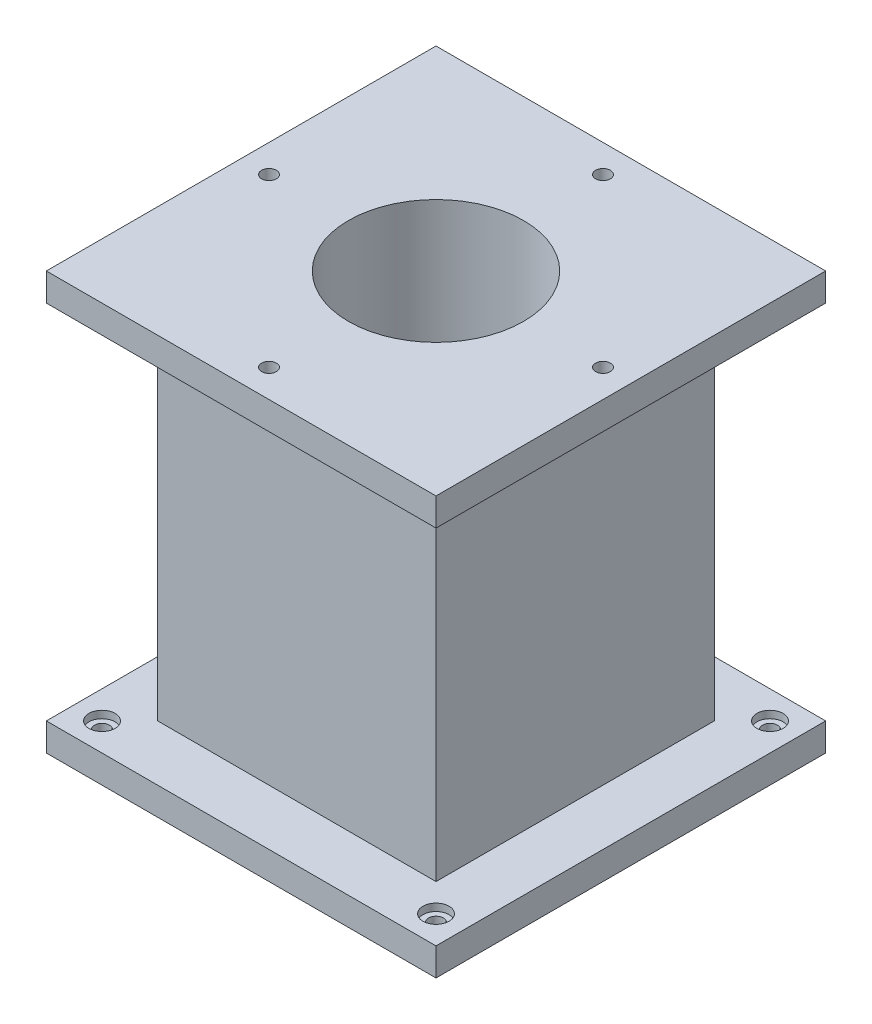
ISO-10303-21;
HEADER;
FILE_DESCRIPTION(('STEP AP214'),'2;1');
FILE_NAME('part.step','',(''),(''),'','','');
FILE_SCHEMA(('AUTOMOTIVE_DESIGN { 1 0 10303 214 1 1 1 1 }'));
ENDSEC;
DATA;
#1=APPLICATION_CONTEXT('core data for automotive mechanical design processes');
#2=APPLICATION_PROTOCOL_DEFINITION('international standard','automotive_design',2000,#1);
#3=PRODUCT_CONTEXT('',#1,'mechanical');
#4=PRODUCT('Part','Part','',(#3));
#5=PRODUCT_RELATED_PRODUCT_CATEGORY('part','',(#4));
#6=PRODUCT_DEFINITION_FORMATION('','',#4);
#7=PRODUCT_DEFINITION_CONTEXT('part definition',#1,'design');
#8=PRODUCT_DEFINITION('design','',#6,#7);
#9=PRODUCT_DEFINITION_SHAPE('','',#8);
#10=(LENGTH_UNIT() NAMED_UNIT(*) SI_UNIT(.MILLI.,.METRE.));
#11=(NAMED_UNIT(*) PLANE_ANGLE_UNIT() SI_UNIT($,.RADIAN.));
#12=(NAMED_UNIT(*) SI_UNIT($,.STERADIAN.) SOLID_ANGLE_UNIT());
#13=UNCERTAINTY_MEASURE_WITH_UNIT(LENGTH_MEASURE(1.E-05),#10,'distance_accuracy_value','');
#14=(GEOMETRIC_REPRESENTATION_CONTEXT(3) GLOBAL_UNCERTAINTY_ASSIGNED_CONTEXT((#13)) GLOBAL_UNIT_ASSIGNED_CONTEXT((#10,
#11,#12)) REPRESENTATION_CONTEXT('',''));
#15=CARTESIAN_POINT('',(0.,0.,0.));
#16=DIRECTION('',(0.,0.,1.));
#17=DIRECTION('',(1.,0.,0.));
#18=AXIS2_PLACEMENT_3D('',#15,#16,#17);
#19=CARTESIAN_POINT('',(0.,12.7,0.));
#20=DIRECTION('',(0.,-1.,0.));
#21=DIRECTION('',(0.,0.,-1.));
#22=AXIS2_PLACEMENT_3D('',#19,#20,#21);
#23=PLANE('',#22);
#24=CARTESIAN_POINT('',(76.2000000000008,12.7,76.1999999999992));
#25=DIRECTION('',(0.,1.,0.));
#26=DIRECTION('',(0.,0.,1.));
#27=AXIS2_PLACEMENT_3D('',#24,#25,#26);
#28=CIRCLE('',#27,5.95376);
#29=CARTESIAN_POINT('',(76.2000000000008,12.7,82.1537599999992));
#30=VERTEX_POINT('',#29);
#31=EDGE_CURVE('E181',#30,#30,#28,.T.);
#32=ORIENTED_EDGE('',*,*,#31,.F.);
#33=EDGE_LOOP('',(#32));
#34=FACE_BOUND('',#33,.T.);
#35=DIRECTION('',(0.,0.,-1.));
#36=VECTOR('',#35,1.);
#37=CARTESIAN_POINT('',(88.9,12.7,88.9));
#38=LINE('',#37,#36);
#39=CARTESIAN_POINT('',(88.9,12.7,88.9));
#40=VERTEX_POINT('',#39);
#41=CARTESIAN_POINT('',(88.9,12.7,-88.9));
#42=VERTEX_POINT('',#41);
#43=EDGE_CURVE('E230',#40,#42,#38,.T.);
#44=ORIENTED_EDGE('',*,*,#43,.T.);
#45=DIRECTION('',(-1.,0.,0.));
#46=VECTOR('',#45,1.);
#47=CARTESIAN_POINT('',(-88.9,12.7,-88.9));
#48=LINE('',#47,#46);
#49=CARTESIAN_POINT('',(-88.9,12.7,-88.9));
#50=VERTEX_POINT('',#49);
#51=EDGE_CURVE('E233',#42,#50,#48,.T.);
#52=ORIENTED_EDGE('',*,*,#51,.T.);
#53=DIRECTION('',(0.,0.,1.));
#54=VECTOR('',#53,1.);
#55=CARTESIAN_POINT('',(-88.9,12.7,88.9));
#56=LINE('',#55,#54);
#57=CARTESIAN_POINT('',(-88.9,12.7,88.9));
#58=VERTEX_POINT('',#57);
#59=EDGE_CURVE('E236',#50,#58,#56,.T.);
#60=ORIENTED_EDGE('',*,*,#59,.T.);
#61=DIRECTION('',(1.,0.,0.));
#62=VECTOR('',#61,1.);
#63=CARTESIAN_POINT('',(-88.9,12.7,88.9));
#64=LINE('',#63,#62);
#65=EDGE_CURVE('E238',#58,#40,#64,.T.);
#66=ORIENTED_EDGE('',*,*,#65,.T.);
#67=EDGE_LOOP('',(#44,#52,#60,#66));
#68=FACE_BOUND('',#67,.T.);
#69=CARTESIAN_POINT('',(76.2,12.7,-76.2));
#70=DIRECTION('',(0.,1.,0.));
#71=DIRECTION('',(0.,0.,1.));
#72=AXIS2_PLACEMENT_3D('',#69,#70,#71);
#73=CIRCLE('',#72,5.95376);
#74=CARTESIAN_POINT('',(76.2,12.7,-70.24624));
#75=VERTEX_POINT('',#74);
#76=EDGE_CURVE('E217',#75,#75,#73,.T.);
#77=ORIENTED_EDGE('',*,*,#76,.F.);
#78=EDGE_LOOP('',(#77));
#79=FACE_BOUND('',#78,.T.);
#80=CARTESIAN_POINT('',(-76.2000000000003,12.7,-76.1999999999997));
#81=DIRECTION('',(0.,1.,0.));
#82=DIRECTION('',(0.,0.,1.));
#83=AXIS2_PLACEMENT_3D('',#80,#81,#82);
#84=CIRCLE('',#83,5.95376);
#85=CARTESIAN_POINT('',(-76.2000000000003,12.7,-70.2462399999997));
#86=VERTEX_POINT('',#85);
#87=EDGE_CURVE('E205',#86,#86,#84,.T.);
#88=ORIENTED_EDGE('',*,*,#87,.F.);
#89=EDGE_LOOP('',(#88));
#90=FACE_BOUND('',#89,.T.);
#91=CARTESIAN_POINT('',(-76.2,12.7,76.2));
#92=DIRECTION('',(0.,1.,0.));
#93=DIRECTION('',(0.,0.,1.));
#94=AXIS2_PLACEMENT_3D('',#91,#92,#93);
#95=CIRCLE('',#94,5.95376);
#96=CARTESIAN_POINT('',(-76.2,12.7,82.15376));
#97=VERTEX_POINT('',#96);
#98=EDGE_CURVE('E193',#97,#97,#95,.T.);
#99=ORIENTED_EDGE('',*,*,#98,.F.);
#100=EDGE_LOOP('',(#99));
#101=FACE_BOUND('',#100,.T.);
#102=DIRECTION('',(1.,0.,0.));
#103=VECTOR('',#102,1.);
#104=CARTESIAN_POINT('',(63.5,12.7,63.5));
#105=LINE('',#104,#103);
#106=CARTESIAN_POINT('',(-63.5,12.7,63.5));
#107=VERTEX_POINT('',#106);
#108=CARTESIAN_POINT('',(63.5,12.7,63.5));
#109=VERTEX_POINT('',#108);
#110=EDGE_CURVE('E53',#107,#109,#105,.T.);
#111=ORIENTED_EDGE('',*,*,#110,.F.);
#112=DIRECTION('',(0.,0.,1.));
#113=VECTOR('',#112,1.);
#114=CARTESIAN_POINT('',(-63.5,12.7,63.5));
#115=LINE('',#114,#113);
#116=CARTESIAN_POINT('',(-63.5,12.7,-63.5));
#117=VERTEX_POINT('',#116);
#118=EDGE_CURVE('E146',#117,#107,#115,.T.);
#119=ORIENTED_EDGE('',*,*,#118,.F.);
#120=DIRECTION('',(-1.,0.,0.));
#121=VECTOR('',#120,1.);
#122=CARTESIAN_POINT('',(63.5,12.7,-63.5));
#123=LINE('',#122,#121);
#124=CARTESIAN_POINT('',(63.5,12.7,-63.5));
#125=VERTEX_POINT('',#124);
#126=EDGE_CURVE('E149',#125,#117,#123,.T.);
#127=ORIENTED_EDGE('',*,*,#126,.F.);
#128=DIRECTION('',(0.,0.,-1.));
#129=VECTOR('',#128,1.);
#130=CARTESIAN_POINT('',(63.5,12.7,63.5));
#131=LINE('',#130,#129);
#132=EDGE_CURVE('E48',#109,#125,#131,.T.);
#133=ORIENTED_EDGE('',*,*,#132,.F.);
#134=EDGE_LOOP('',(#111,#119,#127,#133));
#135=FACE_BOUND('',#134,.T.);
#136=ADVANCED_FACE('F33',(#34,#68,#79,#90,#101,#135),#23,.F.);
#137=CARTESIAN_POINT('',(0.,0.,0.));
#138=DIRECTION('',(0.,-1.,0.));
#139=DIRECTION('',(0.,0.,-1.));
#140=AXIS2_PLACEMENT_3D('',#137,#138,#139);
#141=PLANE('',#140);
#142=CARTESIAN_POINT('',(0.,0.,0.));
#143=DIRECTION('',(0.,1.,0.));
#144=DIRECTION('',(0.,0.,1.));
#145=AXIS2_PLACEMENT_3D('',#142,#143,#144);
#146=CIRCLE('',#145,39.9252737586509);
#147=CARTESIAN_POINT('',(0.,0.,39.9252737586509));
#148=VERTEX_POINT('',#147);
#149=EDGE_CURVE('E656',#148,#148,#146,.T.);
#150=ORIENTED_EDGE('',*,*,#149,.T.);
#151=EDGE_LOOP('',(#150));
#152=FACE_BOUND('',#151,.T.);
#153=CARTESIAN_POINT('',(76.2000000000008,0.,76.1999999999992));
#154=DIRECTION('',(0.,1.,0.));
#155=DIRECTION('',(0.,0.,1.));
#156=AXIS2_PLACEMENT_3D('',#153,#154,#155);
#157=CIRCLE('',#156,3.3782);
#158=CARTESIAN_POINT('',(76.2000000000008,0.,79.5781999999992));
#159=VERTEX_POINT('',#158);
#160=EDGE_CURVE('E190',#159,#159,#157,.T.);
#161=ORIENTED_EDGE('',*,*,#160,.T.);
#162=EDGE_LOOP('',(#161));
#163=FACE_BOUND('',#162,.T.);
#164=DIRECTION('',(0.,0.,-1.));
#165=VECTOR('',#164,1.);
#166=CARTESIAN_POINT('',(88.9,0.,88.9));
#167=LINE('',#166,#165);
#168=CARTESIAN_POINT('',(88.9,0.,88.9));
#169=VERTEX_POINT('',#168);
#170=CARTESIAN_POINT('',(88.9,0.,-88.9));
#171=VERTEX_POINT('',#170);
#172=EDGE_CURVE('E229',#169,#171,#167,.T.);
#173=ORIENTED_EDGE('',*,*,#172,.F.);
#174=DIRECTION('',(1.,0.,0.));
#175=VECTOR('',#174,1.);
#176=CARTESIAN_POINT('',(-88.9,0.,88.9));
#177=LINE('',#176,#175);
#178=CARTESIAN_POINT('',(-88.9,0.,88.9));
#179=VERTEX_POINT('',#178);
#180=EDGE_CURVE('E234',#179,#169,#177,.T.);
#181=ORIENTED_EDGE('',*,*,#180,.F.);
#182=DIRECTION('',(0.,0.,1.));
#183=VECTOR('',#182,1.);
#184=CARTESIAN_POINT('',(-88.9,0.,88.9));
#185=LINE('',#184,#183);
#186=CARTESIAN_POINT('',(-88.9,0.,-88.9));
#187=VERTEX_POINT('',#186);
#188=EDGE_CURVE('E245',#187,#179,#185,.T.);
#189=ORIENTED_EDGE('',*,*,#188,.F.);
#190=DIRECTION('',(-1.,0.,0.));
#191=VECTOR('',#190,1.);
#192=CARTESIAN_POINT('',(-88.9,0.,-88.9));
#193=LINE('',#192,#191);
#194=EDGE_CURVE('E243',#171,#187,#193,.T.);
#195=ORIENTED_EDGE('',*,*,#194,.F.);
#196=EDGE_LOOP('',(#173,#181,#189,#195));
#197=FACE_BOUND('',#196,.T.);
#198=CARTESIAN_POINT('',(76.2,0.,-76.2));
#199=DIRECTION('',(0.,1.,0.));
#200=DIRECTION('',(0.,0.,1.));
#201=AXIS2_PLACEMENT_3D('',#198,#199,#200);
#202=CIRCLE('',#201,3.3782);
#203=CARTESIAN_POINT('',(76.2,0.,-72.8218));
#204=VERTEX_POINT('',#203);
#205=EDGE_CURVE('E226',#204,#204,#202,.T.);
#206=ORIENTED_EDGE('',*,*,#205,.T.);
#207=EDGE_LOOP('',(#206));
#208=FACE_BOUND('',#207,.T.);
#209=CARTESIAN_POINT('',(-76.2000000000003,0.,-76.1999999999997));
#210=DIRECTION('',(0.,1.,0.));
#211=DIRECTION('',(0.,0.,1.));
#212=AXIS2_PLACEMENT_3D('',#209,#210,#211);
#213=CIRCLE('',#212,3.3782);
#214=CARTESIAN_POINT('',(-76.2000000000003,0.,-72.8217999999997));
#215=VERTEX_POINT('',#214);
#216=EDGE_CURVE('E214',#215,#215,#213,.T.);
#217=ORIENTED_EDGE('',*,*,#216,.T.);
#218=EDGE_LOOP('',(#217));
#219=FACE_BOUND('',#218,.T.);
#220=CARTESIAN_POINT('',(-76.2,0.,76.2));
#221=DIRECTION('',(0.,1.,0.));
#222=DIRECTION('',(0.,0.,1.));
#223=AXIS2_PLACEMENT_3D('',#220,#221,#222);
#224=CIRCLE('',#223,3.3782);
#225=CARTESIAN_POINT('',(-76.2,0.,79.5782));
#226=VERTEX_POINT('',#225);
#227=EDGE_CURVE('E202',#226,#226,#224,.T.);
#228=ORIENTED_EDGE('',*,*,#227,.T.);
#229=EDGE_LOOP('',(#228));
#230=FACE_BOUND('',#229,.T.);
#231=ADVANCED_FACE('F263',(#152,#163,#197,#208,#219,#230),#141,.T.);
#232=CARTESIAN_POINT('',(88.9,12.7,88.9));
#233=DIRECTION('',(-1.,0.,0.));
#234=DIRECTION('',(0.,0.,1.));
#235=AXIS2_PLACEMENT_3D('',#232,#233,#234);
#236=PLANE('',#235);
#237=ORIENTED_EDGE('',*,*,#172,.T.);
#238=DIRECTION('',(0.,-1.,0.));
#239=VECTOR('',#238,1.);
#240=CARTESIAN_POINT('',(88.9,12.7,-88.9));
#241=LINE('',#240,#239);
#242=EDGE_CURVE('E11',#42,#171,#241,.T.);
#243=ORIENTED_EDGE('',*,*,#242,.F.);
#244=ORIENTED_EDGE('',*,*,#43,.F.);
#245=DIRECTION('',(0.,-1.,0.));
#246=VECTOR('',#245,1.);
#247=CARTESIAN_POINT('',(88.9,12.7,88.9));
#248=LINE('',#247,#246);
#249=EDGE_CURVE('E240',#40,#169,#248,.T.);
#250=ORIENTED_EDGE('',*,*,#249,.T.);
#251=EDGE_LOOP('',(#237,#243,#244,#250));
#252=FACE_BOUND('',#251,.T.);
#253=ADVANCED_FACE('F35',(#252),#236,.F.);
#254=CARTESIAN_POINT('',(-88.9,12.7,-88.9));
#255=DIRECTION('',(0.,0.,1.));
#256=DIRECTION('',(1.,0.,0.));
#257=AXIS2_PLACEMENT_3D('',#254,#255,#256);
#258=PLANE('',#257);
#259=ORIENTED_EDGE('',*,*,#194,.T.);
#260=DIRECTION('',(0.,-1.,0.));
#261=VECTOR('',#260,1.);
#262=CARTESIAN_POINT('',(-88.9,12.7,-88.9));
#263=LINE('',#262,#261);
#264=EDGE_CURVE('E41',#50,#187,#263,.T.);
#265=ORIENTED_EDGE('',*,*,#264,.F.);
#266=ORIENTED_EDGE('',*,*,#51,.F.);
#267=ORIENTED_EDGE('',*,*,#242,.T.);
#268=EDGE_LOOP('',(#259,#265,#266,#267));
#269=FACE_BOUND('',#268,.T.);
#270=ADVANCED_FACE('F274',(#269),#258,.F.);
#271=CARTESIAN_POINT('',(-88.9,12.7,88.9));
#272=DIRECTION('',(1.,0.,0.));
#273=DIRECTION('',(0.,0.,-1.));
#274=AXIS2_PLACEMENT_3D('',#271,#272,#273);
#275=PLANE('',#274);
#276=ORIENTED_EDGE('',*,*,#188,.T.);
#277=DIRECTION('',(0.,-1.,0.));
#278=VECTOR('',#277,1.);
#279=CARTESIAN_POINT('',(-88.9,12.7,88.9));
#280=LINE('',#279,#278);
#281=EDGE_CURVE('E250',#58,#179,#280,.T.);
#282=ORIENTED_EDGE('',*,*,#281,.F.);
#283=ORIENTED_EDGE('',*,*,#59,.F.);
#284=ORIENTED_EDGE('',*,*,#264,.T.);
#285=EDGE_LOOP('',(#276,#282,#283,#284));
#286=FACE_BOUND('',#285,.T.);
#287=ADVANCED_FACE('F257',(#286),#275,.F.);
#288=CARTESIAN_POINT('',(-88.9,12.7,88.9));
#289=DIRECTION('',(0.,0.,-1.));
#290=DIRECTION('',(-1.,0.,0.));
#291=AXIS2_PLACEMENT_3D('',#288,#289,#290);
#292=PLANE('',#291);
#293=ORIENTED_EDGE('',*,*,#180,.T.);
#294=ORIENTED_EDGE('',*,*,#249,.F.);
#295=ORIENTED_EDGE('',*,*,#65,.F.);
#296=ORIENTED_EDGE('',*,*,#281,.T.);
#297=EDGE_LOOP('',(#293,#294,#295,#296));
#298=FACE_BOUND('',#297,.T.);
#299=ADVANCED_FACE('F267',(#298),#292,.F.);
#300=CARTESIAN_POINT('',(76.2,12.7,-76.2));
#301=DIRECTION('',(0.,1.,0.));
#302=DIRECTION('',(0.,0.,1.));
#303=AXIS2_PLACEMENT_3D('',#300,#301,#302);
#304=CYLINDRICAL_SURFACE('',#303,3.3782);
#305=ORIENTED_EDGE('',*,*,#205,.F.);
#306=EDGE_LOOP('',(#305));
#307=FACE_BOUND('',#306,.T.);
#308=CARTESIAN_POINT('',(76.2,9.3472,-76.2));
#309=DIRECTION('',(0.,1.,0.));
#310=DIRECTION('',(0.,0.,1.));
#311=AXIS2_PLACEMENT_3D('',#308,#309,#310);
#312=CIRCLE('',#311,3.3782);
#313=CARTESIAN_POINT('',(76.2,9.3472,-72.8218));
#314=VERTEX_POINT('',#313);
#315=EDGE_CURVE('E223',#314,#314,#312,.T.);
#316=ORIENTED_EDGE('',*,*,#315,.T.);
#317=EDGE_LOOP('',(#316));
#318=FACE_BOUND('',#317,.T.);
#319=ADVANCED_FACE('F291',(#307,#318),#304,.F.);
#320=CARTESIAN_POINT('',(79.5782,9.3472,-76.2));
#321=DIRECTION('',(0.,-1.,0.));
#322=DIRECTION('',(0.,0.,-1.));
#323=AXIS2_PLACEMENT_3D('',#320,#321,#322);
#324=PLANE('',#323);
#325=ORIENTED_EDGE('',*,*,#315,.F.);
#326=EDGE_LOOP('',(#325));
#327=FACE_BOUND('',#326,.T.);
#328=CARTESIAN_POINT('',(76.2,9.3472,-76.2));
#329=DIRECTION('',(0.,1.,0.));
#330=DIRECTION('',(0.,0.,1.));
#331=AXIS2_PLACEMENT_3D('',#328,#329,#330);
#332=CIRCLE('',#331,5.95376);
#333=CARTESIAN_POINT('',(76.2,9.3472,-70.24624));
#334=VERTEX_POINT('',#333);
#335=EDGE_CURVE('E220',#334,#334,#332,.T.);
#336=ORIENTED_EDGE('',*,*,#335,.T.);
#337=EDGE_LOOP('',(#336));
#338=FACE_BOUND('',#337,.T.);
#339=ADVANCED_FACE('F298',(#327,#338),#324,.F.);
#340=CARTESIAN_POINT('',(76.2,12.7,-76.2));
#341=DIRECTION('',(0.,1.,0.));
#342=DIRECTION('',(0.,0.,1.));
#343=AXIS2_PLACEMENT_3D('',#340,#341,#342);
#344=CYLINDRICAL_SURFACE('',#343,5.95376);
#345=ORIENTED_EDGE('',*,*,#335,.F.);
#346=EDGE_LOOP('',(#345));
#347=FACE_BOUND('',#346,.T.);
#348=ORIENTED_EDGE('',*,*,#76,.T.);
#349=EDGE_LOOP('',(#348));
#350=FACE_BOUND('',#349,.T.);
#351=ADVANCED_FACE('F303',(#347,#350),#344,.F.);
#352=CARTESIAN_POINT('',(-76.2000000000003,12.7,-76.1999999999997));
#353=DIRECTION('',(0.,1.,0.));
#354=DIRECTION('',(0.,0.,1.));
#355=AXIS2_PLACEMENT_3D('',#352,#353,#354);
#356=CYLINDRICAL_SURFACE('',#355,3.3782);
#357=ORIENTED_EDGE('',*,*,#216,.F.);
#358=EDGE_LOOP('',(#357));
#359=FACE_BOUND('',#358,.T.);
#360=CARTESIAN_POINT('',(-76.2000000000003,9.3472,-76.1999999999997));
#361=DIRECTION('',(0.,1.,0.));
#362=DIRECTION('',(0.,0.,1.));
#363=AXIS2_PLACEMENT_3D('',#360,#361,#362);
#364=CIRCLE('',#363,3.3782);
#365=CARTESIAN_POINT('',(-76.2000000000003,9.3472,-72.8217999999997));
#366=VERTEX_POINT('',#365);
#367=EDGE_CURVE('E211',#366,#366,#364,.T.);
#368=ORIENTED_EDGE('',*,*,#367,.T.);
#369=EDGE_LOOP('',(#368));
#370=FACE_BOUND('',#369,.T.);
#371=ADVANCED_FACE('F313',(#359,#370),#356,.F.);
#372=CARTESIAN_POINT('',(-72.8218000000003,9.3472,-76.1999999999997));
#373=DIRECTION('',(0.,-1.,0.));
#374=DIRECTION('',(0.,0.,-1.));
#375=AXIS2_PLACEMENT_3D('',#372,#373,#374);
#376=PLANE('',#375);
#377=ORIENTED_EDGE('',*,*,#367,.F.);
#378=EDGE_LOOP('',(#377));
#379=FACE_BOUND('',#378,.T.);
#380=CARTESIAN_POINT('',(-76.2000000000003,9.3472,-76.1999999999997));
#381=DIRECTION('',(0.,1.,0.));
#382=DIRECTION('',(0.,0.,1.));
#383=AXIS2_PLACEMENT_3D('',#380,#381,#382);
#384=CIRCLE('',#383,5.95376);
#385=CARTESIAN_POINT('',(-76.2000000000003,9.3472,-70.2462399999997));
#386=VERTEX_POINT('',#385);
#387=EDGE_CURVE('E208',#386,#386,#384,.T.);
#388=ORIENTED_EDGE('',*,*,#387,.T.);
#389=EDGE_LOOP('',(#388));
#390=FACE_BOUND('',#389,.T.);
#391=ADVANCED_FACE('F346',(#379,#390),#376,.F.);
#392=CARTESIAN_POINT('',(-76.2000000000003,12.7,-76.1999999999997));
#393=DIRECTION('',(0.,1.,0.));
#394=DIRECTION('',(0.,0.,1.));
#395=AXIS2_PLACEMENT_3D('',#392,#393,#394);
#396=CYLINDRICAL_SURFACE('',#395,5.95376);
#397=ORIENTED_EDGE('',*,*,#387,.F.);
#398=EDGE_LOOP('',(#397));
#399=FACE_BOUND('',#398,.T.);
#400=ORIENTED_EDGE('',*,*,#87,.T.);
#401=EDGE_LOOP('',(#400));
#402=FACE_BOUND('',#401,.T.);
#403=ADVANCED_FACE('F342',(#399,#402),#396,.F.);
#404=CARTESIAN_POINT('',(-76.2,12.7,76.2));
#405=DIRECTION('',(0.,1.,0.));
#406=DIRECTION('',(0.,0.,1.));
#407=AXIS2_PLACEMENT_3D('',#404,#405,#406);
#408=CYLINDRICAL_SURFACE('',#407,3.3782);
#409=ORIENTED_EDGE('',*,*,#227,.F.);
#410=EDGE_LOOP('',(#409));
#411=FACE_BOUND('',#410,.T.);
#412=CARTESIAN_POINT('',(-76.2,9.3472,76.2));
#413=DIRECTION('',(0.,1.,0.));
#414=DIRECTION('',(0.,0.,1.));
#415=AXIS2_PLACEMENT_3D('',#412,#413,#414);
#416=CIRCLE('',#415,3.3782);
#417=CARTESIAN_POINT('',(-76.2,9.3472,79.5782));
#418=VERTEX_POINT('',#417);
#419=EDGE_CURVE('E199',#418,#418,#416,.T.);
#420=ORIENTED_EDGE('',*,*,#419,.T.);
#421=EDGE_LOOP('',(#420));
#422=FACE_BOUND('',#421,.T.);
#423=ADVANCED_FACE('F334',(#411,#422),#408,.F.);
#424=CARTESIAN_POINT('',(-72.8218,9.3472,76.2));
#425=DIRECTION('',(0.,-1.,0.));
#426=DIRECTION('',(0.,0.,-1.));
#427=AXIS2_PLACEMENT_3D('',#424,#425,#426);
#428=PLANE('',#427);
#429=ORIENTED_EDGE('',*,*,#419,.F.);
#430=EDGE_LOOP('',(#429));
#431=FACE_BOUND('',#430,.T.);
#432=CARTESIAN_POINT('',(-76.2,9.3472,76.2));
#433=DIRECTION('',(0.,1.,0.));
#434=DIRECTION('',(0.,0.,1.));
#435=AXIS2_PLACEMENT_3D('',#432,#433,#434);
#436=CIRCLE('',#435,5.95376);
#437=CARTESIAN_POINT('',(-76.2,9.3472,82.15376));
#438=VERTEX_POINT('',#437);
#439=EDGE_CURVE('E196',#438,#438,#436,.T.);
#440=ORIENTED_EDGE('',*,*,#439,.T.);
#441=EDGE_LOOP('',(#440));
#442=FACE_BOUND('',#441,.T.);
#443=ADVANCED_FACE('F324',(#431,#442),#428,.F.);
#444=CARTESIAN_POINT('',(-76.2,12.7,76.2));
#445=DIRECTION('',(0.,1.,0.));
#446=DIRECTION('',(0.,0.,1.));
#447=AXIS2_PLACEMENT_3D('',#444,#445,#446);
#448=CYLINDRICAL_SURFACE('',#447,5.95376);
#449=ORIENTED_EDGE('',*,*,#439,.F.);
#450=EDGE_LOOP('',(#449));
#451=FACE_BOUND('',#450,.T.);
#452=ORIENTED_EDGE('',*,*,#98,.T.);
#453=EDGE_LOOP('',(#452));
#454=FACE_BOUND('',#453,.T.);
#455=ADVANCED_FACE('F321',(#451,#454),#448,.F.);
#456=CARTESIAN_POINT('',(76.2000000000008,12.7,76.1999999999992));
#457=DIRECTION('',(0.,1.,0.));
#458=DIRECTION('',(0.,0.,1.));
#459=AXIS2_PLACEMENT_3D('',#456,#457,#458);
#460=CYLINDRICAL_SURFACE('',#459,3.3782);
#461=ORIENTED_EDGE('',*,*,#160,.F.);
#462=EDGE_LOOP('',(#461));
#463=FACE_BOUND('',#462,.T.);
#464=CARTESIAN_POINT('',(76.2000000000008,9.3472,76.1999999999992));
#465=DIRECTION('',(0.,1.,0.));
#466=DIRECTION('',(0.,0.,1.));
#467=AXIS2_PLACEMENT_3D('',#464,#465,#466);
#468=CIRCLE('',#467,3.3782);
#469=CARTESIAN_POINT('',(76.2000000000008,9.3472,79.5781999999992));
#470=VERTEX_POINT('',#469);
#471=EDGE_CURVE('E187',#470,#470,#468,.T.);
#472=ORIENTED_EDGE('',*,*,#471,.T.);
#473=EDGE_LOOP('',(#472));
#474=FACE_BOUND('',#473,.T.);
#475=ADVANCED_FACE('F323',(#463,#474),#460,.F.);
#476=CARTESIAN_POINT('',(79.5782000000008,9.3472,76.1999999999992));
#477=DIRECTION('',(0.,-1.,0.));
#478=DIRECTION('',(0.,0.,-1.));
#479=AXIS2_PLACEMENT_3D('',#476,#477,#478);
#480=PLANE('',#479);
#481=ORIENTED_EDGE('',*,*,#471,.F.);
#482=EDGE_LOOP('',(#481));
#483=FACE_BOUND('',#482,.T.);
#484=CARTESIAN_POINT('',(76.2000000000008,9.3472,76.1999999999992));
#485=DIRECTION('',(0.,1.,0.));
#486=DIRECTION('',(0.,0.,1.));
#487=AXIS2_PLACEMENT_3D('',#484,#485,#486);
#488=CIRCLE('',#487,5.95376);
#489=CARTESIAN_POINT('',(76.2000000000008,9.3472,82.1537599999992));
#490=VERTEX_POINT('',#489);
#491=EDGE_CURVE('E184',#490,#490,#488,.T.);
#492=ORIENTED_EDGE('',*,*,#491,.T.);
#493=EDGE_LOOP('',(#492));
#494=FACE_BOUND('',#493,.T.);
#495=ADVANCED_FACE('F331',(#483,#494),#480,.F.);
#496=CARTESIAN_POINT('',(76.2000000000008,12.7,76.1999999999992));
#497=DIRECTION('',(0.,1.,0.));
#498=DIRECTION('',(0.,0.,1.));
#499=AXIS2_PLACEMENT_3D('',#496,#497,#498);
#500=CYLINDRICAL_SURFACE('',#499,5.95376);
#501=ORIENTED_EDGE('',*,*,#491,.F.);
#502=EDGE_LOOP('',(#501));
#503=FACE_BOUND('',#502,.T.);
#504=ORIENTED_EDGE('',*,*,#31,.T.);
#505=EDGE_LOOP('',(#504));
#506=FACE_BOUND('',#505,.T.);
#507=ADVANCED_FACE('F404',(#503,#506),#500,.F.);
#508=CARTESIAN_POINT('',(63.5,500000.,63.5));
#509=DIRECTION('',(0.,0.,-1.));
#510=DIRECTION('',(-1.,0.,0.));
#511=AXIS2_PLACEMENT_3D('',#508,#509,#510);
#512=PLANE('',#511);
#513=DIRECTION('',(0.,-1.,0.));
#514=VECTOR('',#513,1.);
#515=CARTESIAN_POINT('',(63.5,500000.,63.5));
#516=LINE('',#515,#514);
#517=CARTESIAN_POINT('',(63.5,177.800000000104,63.5));
#518=VERTEX_POINT('',#517);
#519=EDGE_CURVE('E163',#518,#109,#516,.T.);
#520=ORIENTED_EDGE('',*,*,#519,.F.);
#521=DIRECTION('',(-1.,0.,0.));
#522=VECTOR('',#521,1.);
#523=CARTESIAN_POINT('',(63.5,177.799999999991,63.5));
#524=LINE('',#523,#522);
#525=CARTESIAN_POINT('',(-63.5,177.800000000104,63.5));
#526=VERTEX_POINT('',#525);
#527=EDGE_CURVE('E175',#518,#526,#524,.T.);
#528=ORIENTED_EDGE('',*,*,#527,.T.);
#529=DIRECTION('',(0.,-1.,0.));
#530=VECTOR('',#529,1.);
#531=CARTESIAN_POINT('',(-63.5,500000.,63.5));
#532=LINE('',#531,#530);
#533=EDGE_CURVE('E160',#526,#107,#532,.T.);
#534=ORIENTED_EDGE('',*,*,#533,.T.);
#535=ORIENTED_EDGE('',*,*,#110,.T.);
#536=EDGE_LOOP('',(#520,#528,#534,#535));
#537=FACE_BOUND('',#536,.T.);
#538=ADVANCED_FACE('F412',(#537),#512,.F.);
#539=CARTESIAN_POINT('',(63.5,500000.,63.5));
#540=DIRECTION('',(-1.,0.,0.));
#541=DIRECTION('',(0.,0.,1.));
#542=AXIS2_PLACEMENT_3D('',#539,#540,#541);
#543=PLANE('',#542);
#544=DIRECTION('',(0.,-1.,0.));
#545=VECTOR('',#544,1.);
#546=CARTESIAN_POINT('',(63.5,500000.,-63.5));
#547=LINE('',#546,#545);
#548=CARTESIAN_POINT('',(63.5,177.800000000104,-63.5));
#549=VERTEX_POINT('',#548);
#550=EDGE_CURVE('E165',#549,#125,#547,.T.);
#551=ORIENTED_EDGE('',*,*,#550,.F.);
#552=DIRECTION('',(0.,0.,1.));
#553=VECTOR('',#552,1.);
#554=CARTESIAN_POINT('',(63.5,177.799999999991,63.5));
#555=LINE('',#554,#553);
#556=EDGE_CURVE('E172',#549,#518,#555,.T.);
#557=ORIENTED_EDGE('',*,*,#556,.T.);
#558=ORIENTED_EDGE('',*,*,#519,.T.);
#559=ORIENTED_EDGE('',*,*,#132,.T.);
#560=EDGE_LOOP('',(#551,#557,#558,#559));
#561=FACE_BOUND('',#560,.T.);
#562=ADVANCED_FACE('F429',(#561),#543,.F.);
#563=CARTESIAN_POINT('',(-63.5,500000.,63.5));
#564=DIRECTION('',(1.,0.,0.));
#565=DIRECTION('',(0.,0.,-1.));
#566=AXIS2_PLACEMENT_3D('',#563,#564,#565);
#567=PLANE('',#566);
#568=ORIENTED_EDGE('',*,*,#533,.F.);
#569=DIRECTION('',(0.,0.,-1.));
#570=VECTOR('',#569,1.);
#571=CARTESIAN_POINT('',(-63.5,177.799999999991,63.5));
#572=LINE('',#571,#570);
#573=CARTESIAN_POINT('',(-63.5,177.800000000104,-63.5));
#574=VERTEX_POINT('',#573);
#575=EDGE_CURVE('E178',#526,#574,#572,.T.);
#576=ORIENTED_EDGE('',*,*,#575,.T.);
#577=DIRECTION('',(0.,-1.,0.));
#578=VECTOR('',#577,1.);
#579=CARTESIAN_POINT('',(-63.5,500000.,-63.5));
#580=LINE('',#579,#578);
#581=EDGE_CURVE('E158',#574,#117,#580,.T.);
#582=ORIENTED_EDGE('',*,*,#581,.T.);
#583=ORIENTED_EDGE('',*,*,#118,.T.);
#584=EDGE_LOOP('',(#568,#576,#582,#583));
#585=FACE_BOUND('',#584,.T.);
#586=ADVANCED_FACE('F441',(#585),#567,.F.);
#587=CARTESIAN_POINT('',(63.5,500000.,-63.5));
#588=DIRECTION('',(0.,0.,1.));
#589=DIRECTION('',(1.,0.,0.));
#590=AXIS2_PLACEMENT_3D('',#587,#588,#589);
#591=PLANE('',#590);
#592=ORIENTED_EDGE('',*,*,#581,.F.);
#593=DIRECTION('',(1.,0.,0.));
#594=VECTOR('',#593,1.);
#595=CARTESIAN_POINT('',(63.5,177.799999999991,-63.5));
#596=LINE('',#595,#594);
#597=EDGE_CURVE('E162',#574,#549,#596,.T.);
#598=ORIENTED_EDGE('',*,*,#597,.T.);
#599=ORIENTED_EDGE('',*,*,#550,.T.);
#600=ORIENTED_EDGE('',*,*,#126,.T.);
#601=EDGE_LOOP('',(#592,#598,#599,#600));
#602=FACE_BOUND('',#601,.T.);
#603=ADVANCED_FACE('F415',(#602),#591,.F.);
#604=CARTESIAN_POINT('',(0.,177.8,0.));
#605=DIRECTION('',(0.,-1.,0.));
#606=DIRECTION('',(0.,0.,-1.));
#607=AXIS2_PLACEMENT_3D('',#604,#605,#606);
#608=PLANE('',#607);
#609=DIRECTION('',(0.,0.,-1.));
#610=VECTOR('',#609,1.);
#611=CARTESIAN_POINT('',(88.9,177.8,88.9));
#612=LINE('',#611,#610);
#613=CARTESIAN_POINT('',(88.9,177.8,88.9));
#614=VERTEX_POINT('',#613);
#615=CARTESIAN_POINT('',(88.9,177.8,-88.9));
#616=VERTEX_POINT('',#615);
#617=EDGE_CURVE('E145',#614,#616,#612,.T.);
#618=ORIENTED_EDGE('',*,*,#617,.F.);
#619=DIRECTION('',(1.,0.,0.));
#620=VECTOR('',#619,1.);
#621=CARTESIAN_POINT('',(-88.9,177.8,88.9));
#622=LINE('',#621,#620);
#623=CARTESIAN_POINT('',(-88.9,177.8,88.9));
#624=VERTEX_POINT('',#623);
#625=EDGE_CURVE('E141',#624,#614,#622,.T.);
#626=ORIENTED_EDGE('',*,*,#625,.F.);
#627=DIRECTION('',(0.,0.,1.));
#628=VECTOR('',#627,1.);
#629=CARTESIAN_POINT('',(-88.9,177.8,88.9));
#630=LINE('',#629,#628);
#631=CARTESIAN_POINT('',(-88.9,177.8,-88.9));
#632=VERTEX_POINT('',#631);
#633=EDGE_CURVE('E717',#632,#624,#630,.T.);
#634=ORIENTED_EDGE('',*,*,#633,.F.);
#635=DIRECTION('',(-1.,0.,0.));
#636=VECTOR('',#635,1.);
#637=CARTESIAN_POINT('',(-88.9,177.8,-88.9));
#638=LINE('',#637,#636);
#639=EDGE_CURVE('E715',#616,#632,#638,.T.);
#640=ORIENTED_EDGE('',*,*,#639,.F.);
#641=EDGE_LOOP('',(#618,#626,#634,#640));
#642=FACE_BOUND('',#641,.T.);
#643=CARTESIAN_POINT('',(76.1999999999999,177.8,0.));
#644=DIRECTION('',(0.,-1.,0.));
#645=DIRECTION('',(0.,0.,-1.));
#646=AXIS2_PLACEMENT_3D('',#643,#644,#645);
#647=CIRCLE('',#646,5.95375999999999);
#648=CARTESIAN_POINT('',(76.1999999999999,177.8,-5.95375999999999));
#649=VERTEX_POINT('',#648);
#650=EDGE_CURVE('E699',#649,#649,#647,.T.);
#651=ORIENTED_EDGE('',*,*,#650,.F.);
#652=EDGE_LOOP('',(#651));
#653=FACE_BOUND('',#652,.T.);
#654=CARTESIAN_POINT('',(-2.66050878019847E-13,177.8,-76.1999999999999));
#655=DIRECTION('',(0.,-1.,0.));
#656=DIRECTION('',(0.,0.,-1.));
#657=AXIS2_PLACEMENT_3D('',#654,#655,#656);
#658=CIRCLE('',#657,5.95376);
#659=CARTESIAN_POINT('',(-2.66050878019847E-13,177.8,-82.1537599999999));
#660=VERTEX_POINT('',#659);
#661=EDGE_CURVE('E687',#660,#660,#658,.T.);
#662=ORIENTED_EDGE('',*,*,#661,.F.);
#663=EDGE_LOOP('',(#662));
#664=FACE_BOUND('',#663,.T.);
#665=CARTESIAN_POINT('',(-76.1999999999999,177.8,0.));
#666=DIRECTION('',(0.,-1.,0.));
#667=DIRECTION('',(0.,0.,-1.));
#668=AXIS2_PLACEMENT_3D('',#665,#666,#667);
#669=CIRCLE('',#668,5.95375999999999);
#670=CARTESIAN_POINT('',(-76.1999999999999,177.8,-5.95375999999999));
#671=VERTEX_POINT('',#670);
#672=EDGE_CURVE('E675',#671,#671,#669,.T.);
#673=ORIENTED_EDGE('',*,*,#672,.F.);
#674=EDGE_LOOP('',(#673));
#675=FACE_BOUND('',#674,.T.);
#676=CARTESIAN_POINT('',(7.9815263405954E-13,177.8,76.1999999999999));
#677=DIRECTION('',(0.,-1.,0.));
#678=DIRECTION('',(0.,0.,-1.));
#679=AXIS2_PLACEMENT_3D('',#676,#677,#678);
#680=CIRCLE('',#679,5.95376);
#681=CARTESIAN_POINT('',(7.9815263405954E-13,177.8,70.24624));
#682=VERTEX_POINT('',#681);
#683=EDGE_CURVE('E661',#682,#682,#680,.T.);
#684=ORIENTED_EDGE('',*,*,#683,.F.);
#685=EDGE_LOOP('',(#684));
#686=FACE_BOUND('',#685,.T.);
#687=ORIENTED_EDGE('',*,*,#527,.F.);
#688=ORIENTED_EDGE('',*,*,#556,.F.);
#689=ORIENTED_EDGE('',*,*,#597,.F.);
#690=ORIENTED_EDGE('',*,*,#575,.F.);
#691=EDGE_LOOP('',(#687,#688,#689,#690));
#692=FACE_BOUND('',#691,.T.);
#693=ADVANCED_FACE('F432',(#642,#653,#664,#675,#686,#692),#608,.T.);
#694=CARTESIAN_POINT('',(88.9,190.5,88.9));
#695=DIRECTION('',(-1.,0.,0.));
#696=DIRECTION('',(0.,0.,1.));
#697=AXIS2_PLACEMENT_3D('',#694,#695,#696);
#698=PLANE('',#697);
#699=ORIENTED_EDGE('',*,*,#617,.T.);
#700=DIRECTION('',(0.,-1.,0.));
#701=VECTOR('',#700,1.);
#702=CARTESIAN_POINT('',(88.9,190.5,-88.9));
#703=LINE('',#702,#701);
#704=CARTESIAN_POINT('',(88.9,190.5,-88.9));
#705=VERTEX_POINT('',#704);
#706=EDGE_CURVE('E125',#705,#616,#703,.T.);
#707=ORIENTED_EDGE('',*,*,#706,.F.);
#708=DIRECTION('',(0.,0.,-1.));
#709=VECTOR('',#708,1.);
#710=CARTESIAN_POINT('',(88.9,190.5,88.9));
#711=LINE('',#710,#709);
#712=CARTESIAN_POINT('',(88.9,190.5,88.9));
#713=VERTEX_POINT('',#712);
#714=EDGE_CURVE('E132',#713,#705,#711,.T.);
#715=ORIENTED_EDGE('',*,*,#714,.F.);
#716=DIRECTION('',(0.,-1.,0.));
#717=VECTOR('',#716,1.);
#718=CARTESIAN_POINT('',(88.9,190.5,88.9));
#719=LINE('',#718,#717);
#720=EDGE_CURVE('E713',#713,#614,#719,.T.);
#721=ORIENTED_EDGE('',*,*,#720,.T.);
#722=EDGE_LOOP('',(#699,#707,#715,#721));
#723=FACE_BOUND('',#722,.T.);
#724=ADVANCED_FACE('F143',(#723),#698,.F.);
#725=CARTESIAN_POINT('',(-88.9,190.5,-88.9));
#726=DIRECTION('',(0.,0.,1.));
#727=DIRECTION('',(1.,0.,0.));
#728=AXIS2_PLACEMENT_3D('',#725,#726,#727);
#729=PLANE('',#728);
#730=ORIENTED_EDGE('',*,*,#639,.T.);
#731=DIRECTION('',(0.,-1.,0.));
#732=VECTOR('',#731,1.);
#733=CARTESIAN_POINT('',(-88.9,190.5,-88.9));
#734=LINE('',#733,#732);
#735=CARTESIAN_POINT('',(-88.9,190.5,-88.9));
#736=VERTEX_POINT('',#735);
#737=EDGE_CURVE('E128',#736,#632,#734,.T.);
#738=ORIENTED_EDGE('',*,*,#737,.F.);
#739=DIRECTION('',(-1.,0.,0.));
#740=VECTOR('',#739,1.);
#741=CARTESIAN_POINT('',(-88.9,190.5,-88.9));
#742=LINE('',#741,#740);
#743=EDGE_CURVE('E121',#705,#736,#742,.T.);
#744=ORIENTED_EDGE('',*,*,#743,.F.);
#745=ORIENTED_EDGE('',*,*,#706,.T.);
#746=EDGE_LOOP('',(#730,#738,#744,#745));
#747=FACE_BOUND('',#746,.T.);
#748=ADVANCED_FACE('F123',(#747),#729,.F.);
#749=CARTESIAN_POINT('',(-88.9,190.5,88.9));
#750=DIRECTION('',(1.,0.,0.));
#751=DIRECTION('',(0.,0.,-1.));
#752=AXIS2_PLACEMENT_3D('',#749,#750,#751);
#753=PLANE('',#752);
#754=ORIENTED_EDGE('',*,*,#633,.T.);
#755=DIRECTION('',(0.,-1.,0.));
#756=VECTOR('',#755,1.);
#757=CARTESIAN_POINT('',(-88.9,190.5,88.9));
#758=LINE('',#757,#756);
#759=CARTESIAN_POINT('',(-88.9,190.5,88.9));
#760=VERTEX_POINT('',#759);
#761=EDGE_CURVE('E151',#760,#624,#758,.T.);
#762=ORIENTED_EDGE('',*,*,#761,.F.);
#763=DIRECTION('',(0.,0.,1.));
#764=VECTOR('',#763,1.);
#765=CARTESIAN_POINT('',(-88.9,190.5,88.9));
#766=LINE('',#765,#764);
#767=EDGE_CURVE('E131',#736,#760,#766,.T.);
#768=ORIENTED_EDGE('',*,*,#767,.F.);
#769=ORIENTED_EDGE('',*,*,#737,.T.);
#770=EDGE_LOOP('',(#754,#762,#768,#769));
#771=FACE_BOUND('',#770,.T.);
#772=ADVANCED_FACE('F486',(#771),#753,.F.);
#773=CARTESIAN_POINT('',(-88.9,190.5,88.9));
#774=DIRECTION('',(0.,0.,-1.));
#775=DIRECTION('',(-1.,0.,0.));
#776=AXIS2_PLACEMENT_3D('',#773,#774,#775);
#777=PLANE('',#776);
#778=ORIENTED_EDGE('',*,*,#625,.T.);
#779=ORIENTED_EDGE('',*,*,#720,.F.);
#780=DIRECTION('',(1.,0.,0.));
#781=VECTOR('',#780,1.);
#782=CARTESIAN_POINT('',(-88.9,190.5,88.9));
#783=LINE('',#782,#781);
#784=EDGE_CURVE('E137',#760,#713,#783,.T.);
#785=ORIENTED_EDGE('',*,*,#784,.F.);
#786=ORIENTED_EDGE('',*,*,#761,.T.);
#787=EDGE_LOOP('',(#778,#779,#785,#786));
#788=FACE_BOUND('',#787,.T.);
#789=ADVANCED_FACE('F495',(#788),#777,.F.);
#790=CARTESIAN_POINT('',(0.,190.5,0.));
#791=DIRECTION('',(0.,-1.,0.));
#792=DIRECTION('',(0.,0.,-1.));
#793=AXIS2_PLACEMENT_3D('',#790,#791,#792);
#794=PLANE('',#793);
#795=CARTESIAN_POINT('',(0.,190.5,0.));
#796=DIRECTION('',(0.,1.,0.));
#797=DIRECTION('',(0.,0.,1.));
#798=AXIS2_PLACEMENT_3D('',#795,#796,#797);
#799=CIRCLE('',#798,39.9252737586509);
#800=CARTESIAN_POINT('',(0.,190.5,39.9252737586509));
#801=VERTEX_POINT('',#800);
#802=EDGE_CURVE('E659',#801,#801,#799,.T.);
#803=ORIENTED_EDGE('',*,*,#802,.F.);
#804=EDGE_LOOP('',(#803));
#805=FACE_BOUND('',#804,.T.);
#806=CARTESIAN_POINT('',(7.9815263405954E-13,190.5,76.1999999999999));
#807=DIRECTION('',(0.,-1.,0.));
#808=DIRECTION('',(0.,0.,-1.));
#809=AXIS2_PLACEMENT_3D('',#806,#807,#808);
#810=CIRCLE('',#809,3.3782);
#811=CARTESIAN_POINT('',(7.9815263405954E-13,190.5,72.8218));
#812=VERTEX_POINT('',#811);
#813=EDGE_CURVE('E672',#812,#812,#810,.T.);
#814=ORIENTED_EDGE('',*,*,#813,.T.);
#815=EDGE_LOOP('',(#814));
#816=FACE_BOUND('',#815,.T.);
#817=CARTESIAN_POINT('',(-76.1999999999999,190.5,0.));
#818=DIRECTION('',(0.,-1.,0.));
#819=DIRECTION('',(0.,0.,-1.));
#820=AXIS2_PLACEMENT_3D('',#817,#818,#819);
#821=CIRCLE('',#820,3.3782);
#822=CARTESIAN_POINT('',(-76.1999999999999,190.5,-3.3782));
#823=VERTEX_POINT('',#822);
#824=EDGE_CURVE('E684',#823,#823,#821,.T.);
#825=ORIENTED_EDGE('',*,*,#824,.T.);
#826=EDGE_LOOP('',(#825));
#827=FACE_BOUND('',#826,.T.);
#828=CARTESIAN_POINT('',(-2.66050878019847E-13,190.5,-76.1999999999999));
#829=DIRECTION('',(0.,-1.,0.));
#830=DIRECTION('',(0.,0.,-1.));
#831=AXIS2_PLACEMENT_3D('',#828,#829,#830);
#832=CIRCLE('',#831,3.3782);
#833=CARTESIAN_POINT('',(-2.66050878019847E-13,190.5,-79.5782));
#834=VERTEX_POINT('',#833);
#835=EDGE_CURVE('E696',#834,#834,#832,.T.);
#836=ORIENTED_EDGE('',*,*,#835,.T.);
#837=EDGE_LOOP('',(#836));
#838=FACE_BOUND('',#837,.T.);
#839=CARTESIAN_POINT('',(76.1999999999999,190.5,0.));
#840=DIRECTION('',(0.,-1.,0.));
#841=DIRECTION('',(0.,0.,-1.));
#842=AXIS2_PLACEMENT_3D('',#839,#840,#841);
#843=CIRCLE('',#842,3.3782);
#844=CARTESIAN_POINT('',(76.1999999999999,190.5,-3.3782));
#845=VERTEX_POINT('',#844);
#846=EDGE_CURVE('E708',#845,#845,#843,.T.);
#847=ORIENTED_EDGE('',*,*,#846,.T.);
#848=EDGE_LOOP('',(#847));
#849=FACE_BOUND('',#848,.T.);
#850=ORIENTED_EDGE('',*,*,#714,.T.);
#851=ORIENTED_EDGE('',*,*,#743,.T.);
#852=ORIENTED_EDGE('',*,*,#767,.T.);
#853=ORIENTED_EDGE('',*,*,#784,.T.);
#854=EDGE_LOOP('',(#850,#851,#852,#853));
#855=FACE_BOUND('',#854,.T.);
#856=ADVANCED_FACE('F135',(#805,#816,#827,#838,#849,#855),#794,.F.);
#857=CARTESIAN_POINT('',(76.1999999999999,177.8,0.));
#858=DIRECTION('',(0.,-1.,0.));
#859=DIRECTION('',(0.,0.,-1.));
#860=AXIS2_PLACEMENT_3D('',#857,#858,#859);
#861=CYLINDRICAL_SURFACE('',#860,3.3782);
#862=ORIENTED_EDGE('',*,*,#846,.F.);
#863=EDGE_LOOP('',(#862));
#864=FACE_BOUND('',#863,.T.);
#865=CARTESIAN_POINT('',(76.1999999999999,181.1528,0.));
#866=DIRECTION('',(0.,-1.,0.));
#867=DIRECTION('',(0.,0.,-1.));
#868=AXIS2_PLACEMENT_3D('',#865,#866,#867);
#869=CIRCLE('',#868,3.37820000000001);
#870=CARTESIAN_POINT('',(76.1999999999999,181.1528,-3.37820000000001));
#871=VERTEX_POINT('',#870);
#872=EDGE_CURVE('E705',#871,#871,#869,.T.);
#873=ORIENTED_EDGE('',*,*,#872,.T.);
#874=EDGE_LOOP('',(#873));
#875=FACE_BOUND('',#874,.T.);
#876=ADVANCED_FACE('F512',(#864,#875),#861,.F.);
#877=CARTESIAN_POINT('',(79.5782,181.1528,0.));
#878=DIRECTION('',(0.,1.,0.));
#879=DIRECTION('',(0.,0.,1.));
#880=AXIS2_PLACEMENT_3D('',#877,#878,#879);
#881=PLANE('',#880);
#882=ORIENTED_EDGE('',*,*,#872,.F.);
#883=EDGE_LOOP('',(#882));
#884=FACE_BOUND('',#883,.T.);
#885=CARTESIAN_POINT('',(76.1999999999999,181.1528,0.));
#886=DIRECTION('',(0.,-1.,0.));
#887=DIRECTION('',(0.,0.,-1.));
#888=AXIS2_PLACEMENT_3D('',#885,#886,#887);
#889=CIRCLE('',#888,5.95375999999999);
#890=CARTESIAN_POINT('',(76.1999999999999,181.1528,-5.95375999999999));
#891=VERTEX_POINT('',#890);
#892=EDGE_CURVE('E702',#891,#891,#889,.T.);
#893=ORIENTED_EDGE('',*,*,#892,.T.);
#894=EDGE_LOOP('',(#893));
#895=FACE_BOUND('',#894,.T.);
#896=ADVANCED_FACE('F517',(#884,#895),#881,.F.);
#897=CARTESIAN_POINT('',(76.1999999999999,177.8,0.));
#898=DIRECTION('',(0.,-1.,0.));
#899=DIRECTION('',(0.,0.,-1.));
#900=AXIS2_PLACEMENT_3D('',#897,#898,#899);
#901=CYLINDRICAL_SURFACE('',#900,5.95375999999999);
#902=ORIENTED_EDGE('',*,*,#892,.F.);
#903=EDGE_LOOP('',(#902));
#904=FACE_BOUND('',#903,.T.);
#905=ORIENTED_EDGE('',*,*,#650,.T.);
#906=EDGE_LOOP('',(#905));
#907=FACE_BOUND('',#906,.T.);
#908=ADVANCED_FACE('F527',(#904,#907),#901,.F.);
#909=CARTESIAN_POINT('',(-2.66050878019847E-13,177.8,-76.1999999999999));
#910=DIRECTION('',(0.,-1.,0.));
#911=DIRECTION('',(0.,0.,-1.));
#912=AXIS2_PLACEMENT_3D('',#909,#910,#911);
#913=CYLINDRICAL_SURFACE('',#912,3.3782);
#914=ORIENTED_EDGE('',*,*,#835,.F.);
#915=EDGE_LOOP('',(#914));
#916=FACE_BOUND('',#915,.T.);
#917=CARTESIAN_POINT('',(-2.66050878019847E-13,181.1528,-76.1999999999999));
#918=DIRECTION('',(0.,-1.,0.));
#919=DIRECTION('',(0.,0.,-1.));
#920=AXIS2_PLACEMENT_3D('',#917,#918,#919);
#921=CIRCLE('',#920,3.37820000000001);
#922=CARTESIAN_POINT('',(-2.66050878019847E-13,181.1528,-79.5782));
#923=VERTEX_POINT('',#922);
#924=EDGE_CURVE('E693',#923,#923,#921,.T.);
#925=ORIENTED_EDGE('',*,*,#924,.T.);
#926=EDGE_LOOP('',(#925));
#927=FACE_BOUND('',#926,.T.);
#928=ADVANCED_FACE('F537',(#916,#927),#913,.F.);
#929=CARTESIAN_POINT('',(3.37819999999975,181.1528,-76.1999999999999));
#930=DIRECTION('',(0.,1.,0.));
#931=DIRECTION('',(0.,0.,1.));
#932=AXIS2_PLACEMENT_3D('',#929,#930,#931);
#933=PLANE('',#932);
#934=ORIENTED_EDGE('',*,*,#924,.F.);
#935=EDGE_LOOP('',(#934));
#936=FACE_BOUND('',#935,.T.);
#937=CARTESIAN_POINT('',(-2.66050878019847E-13,181.1528,-76.1999999999999));
#938=DIRECTION('',(0.,-1.,0.));
#939=DIRECTION('',(0.,0.,-1.));
#940=AXIS2_PLACEMENT_3D('',#937,#938,#939);
#941=CIRCLE('',#940,5.95376);
#942=CARTESIAN_POINT('',(-2.66050878019847E-13,181.1528,-82.1537599999999));
#943=VERTEX_POINT('',#942);
#944=EDGE_CURVE('E690',#943,#943,#941,.T.);
#945=ORIENTED_EDGE('',*,*,#944,.T.);
#946=EDGE_LOOP('',(#945));
#947=FACE_BOUND('',#946,.T.);
#948=ADVANCED_FACE('F547',(#936,#947),#933,.F.);
#949=CARTESIAN_POINT('',(-2.66050878019847E-13,177.8,-76.1999999999999));
#950=DIRECTION('',(0.,-1.,0.));
#951=DIRECTION('',(0.,0.,-1.));
#952=AXIS2_PLACEMENT_3D('',#949,#950,#951);
#953=CYLINDRICAL_SURFACE('',#952,5.95376);
#954=ORIENTED_EDGE('',*,*,#944,.F.);
#955=EDGE_LOOP('',(#954));
#956=FACE_BOUND('',#955,.T.);
#957=ORIENTED_EDGE('',*,*,#661,.T.);
#958=EDGE_LOOP('',(#957));
#959=FACE_BOUND('',#958,.T.);
#960=ADVANCED_FACE('F557',(#956,#959),#953,.F.);
#961=CARTESIAN_POINT('',(-76.1999999999999,177.8,0.));
#962=DIRECTION('',(0.,-1.,0.));
#963=DIRECTION('',(0.,0.,-1.));
#964=AXIS2_PLACEMENT_3D('',#961,#962,#963);
#965=CYLINDRICAL_SURFACE('',#964,3.3782);
#966=ORIENTED_EDGE('',*,*,#824,.F.);
#967=EDGE_LOOP('',(#966));
#968=FACE_BOUND('',#967,.T.);
#969=CARTESIAN_POINT('',(-76.1999999999999,181.1528,0.));
#970=DIRECTION('',(0.,-1.,0.));
#971=DIRECTION('',(0.,0.,-1.));
#972=AXIS2_PLACEMENT_3D('',#969,#970,#971);
#973=CIRCLE('',#972,3.37820000000001);
#974=CARTESIAN_POINT('',(-76.1999999999999,181.1528,-3.37820000000001));
#975=VERTEX_POINT('',#974);
#976=EDGE_CURVE('E681',#975,#975,#973,.T.);
#977=ORIENTED_EDGE('',*,*,#976,.T.);
#978=EDGE_LOOP('',(#977));
#979=FACE_BOUND('',#978,.T.);
#980=ADVANCED_FACE('F567',(#968,#979),#965,.F.);
#981=CARTESIAN_POINT('',(-72.8217999999999,181.1528,0.));
#982=DIRECTION('',(0.,1.,0.));
#983=DIRECTION('',(0.,0.,1.));
#984=AXIS2_PLACEMENT_3D('',#981,#982,#983);
#985=PLANE('',#984);
#986=ORIENTED_EDGE('',*,*,#976,.F.);
#987=EDGE_LOOP('',(#986));
#988=FACE_BOUND('',#987,.T.);
#989=CARTESIAN_POINT('',(-76.1999999999999,181.1528,0.));
#990=DIRECTION('',(0.,-1.,0.));
#991=DIRECTION('',(0.,0.,-1.));
#992=AXIS2_PLACEMENT_3D('',#989,#990,#991);
#993=CIRCLE('',#992,5.95375999999999);
#994=CARTESIAN_POINT('',(-76.1999999999999,181.1528,-5.95375999999999));
#995=VERTEX_POINT('',#994);
#996=EDGE_CURVE('E678',#995,#995,#993,.T.);
#997=ORIENTED_EDGE('',*,*,#996,.T.);
#998=EDGE_LOOP('',(#997));
#999=FACE_BOUND('',#998,.T.);
#1000=ADVANCED_FACE('F577',(#988,#999),#985,.F.);
#1001=CARTESIAN_POINT('',(-76.1999999999999,177.8,0.));
#1002=DIRECTION('',(0.,-1.,0.));
#1003=DIRECTION('',(0.,0.,-1.));
#1004=AXIS2_PLACEMENT_3D('',#1001,#1002,#1003);
#1005=CYLINDRICAL_SURFACE('',#1004,5.95375999999999);
#1006=ORIENTED_EDGE('',*,*,#996,.F.);
#1007=EDGE_LOOP('',(#1006));
#1008=FACE_BOUND('',#1007,.T.);
#1009=ORIENTED_EDGE('',*,*,#672,.T.);
#1010=EDGE_LOOP('',(#1009));
#1011=FACE_BOUND('',#1010,.T.);
#1012=ADVANCED_FACE('F587',(#1008,#1011),#1005,.F.);
#1013=CARTESIAN_POINT('',(7.9815263405954E-13,177.8,76.1999999999999));
#1014=DIRECTION('',(0.,-1.,0.));
#1015=DIRECTION('',(0.,0.,-1.));
#1016=AXIS2_PLACEMENT_3D('',#1013,#1014,#1015);
#1017=CYLINDRICAL_SURFACE('',#1016,3.3782);
#1018=ORIENTED_EDGE('',*,*,#813,.F.);
#1019=EDGE_LOOP('',(#1018));
#1020=FACE_BOUND('',#1019,.T.);
#1021=CARTESIAN_POINT('',(7.9815263405954E-13,181.1528,76.1999999999999));
#1022=DIRECTION('',(0.,-1.,0.));
#1023=DIRECTION('',(0.,0.,-1.));
#1024=AXIS2_PLACEMENT_3D('',#1021,#1022,#1023);
#1025=CIRCLE('',#1024,3.37820000000001);
#1026=CARTESIAN_POINT('',(7.9815263405954E-13,181.1528,72.8217999999999));
#1027=VERTEX_POINT('',#1026);
#1028=EDGE_CURVE('E669',#1027,#1027,#1025,.T.);
#1029=ORIENTED_EDGE('',*,*,#1028,.T.);
#1030=EDGE_LOOP('',(#1029));
#1031=FACE_BOUND('',#1030,.T.);
#1032=ADVANCED_FACE('F597',(#1020,#1031),#1017,.F.);
#1033=CARTESIAN_POINT('',(3.37820000000081,181.1528,76.1999999999999));
#1034=DIRECTION('',(0.,1.,0.));
#1035=DIRECTION('',(0.,0.,1.));
#1036=AXIS2_PLACEMENT_3D('',#1033,#1034,#1035);
#1037=PLANE('',#1036);
#1038=ORIENTED_EDGE('',*,*,#1028,.F.);
#1039=EDGE_LOOP('',(#1038));
#1040=FACE_BOUND('',#1039,.T.);
#1041=CARTESIAN_POINT('',(7.9815263405954E-13,181.1528,76.1999999999999));
#1042=DIRECTION('',(0.,-1.,0.));
#1043=DIRECTION('',(0.,0.,-1.));
#1044=AXIS2_PLACEMENT_3D('',#1041,#1042,#1043);
#1045=CIRCLE('',#1044,5.95376);
#1046=CARTESIAN_POINT('',(7.9815263405954E-13,181.1528,70.24624));
#1047=VERTEX_POINT('',#1046);
#1048=EDGE_CURVE('E666',#1047,#1047,#1045,.T.);
#1049=ORIENTED_EDGE('',*,*,#1048,.T.);
#1050=EDGE_LOOP('',(#1049));
#1051=FACE_BOUND('',#1050,.T.);
#1052=ADVANCED_FACE('F607',(#1040,#1051),#1037,.F.);
#1053=CARTESIAN_POINT('',(7.9815263405954E-13,177.8,76.1999999999999));
#1054=DIRECTION('',(0.,-1.,0.));
#1055=DIRECTION('',(0.,0.,-1.));
#1056=AXIS2_PLACEMENT_3D('',#1053,#1054,#1055);
#1057=CYLINDRICAL_SURFACE('',#1056,5.95376);
#1058=ORIENTED_EDGE('',*,*,#1048,.F.);
#1059=EDGE_LOOP('',(#1058));
#1060=FACE_BOUND('',#1059,.T.);
#1061=ORIENTED_EDGE('',*,*,#683,.T.);
#1062=EDGE_LOOP('',(#1061));
#1063=FACE_BOUND('',#1062,.T.);
#1064=ADVANCED_FACE('F617',(#1060,#1063),#1057,.F.);
#1065=CARTESIAN_POINT('',(0.,0.,0.));
#1066=DIRECTION('',(0.,1.,0.));
#1067=DIRECTION('',(0.,0.,1.));
#1068=AXIS2_PLACEMENT_3D('',#1065,#1066,#1067);
#1069=CYLINDRICAL_SURFACE('',#1068,39.9252737586509);
#1070=ORIENTED_EDGE('',*,*,#149,.F.);
#1071=EDGE_LOOP('',(#1070));
#1072=FACE_BOUND('',#1071,.T.);
#1073=ORIENTED_EDGE('',*,*,#802,.T.);
#1074=EDGE_LOOP('',(#1073));
#1075=FACE_BOUND('',#1074,.T.);
#1076=ADVANCED_FACE('F626',(#1072,#1075),#1069,.F.);
#1077=CLOSED_SHELL('',(#136,#231,#253,#270,#287,#299,#319,#339,#351,#371,#391,#403,#423,#443,
#455,#475,#495,#507,#538,#562,#586,#603,#693,#724,#748,#772,#789,#856,#876,#896,#908,#928,#948,
#960,#980,#1000,#1012,#1032,#1052,#1064,#1076));
#1078=MANIFOLD_SOLID_BREP('B2',#1077);
#1079=ADVANCED_BREP_SHAPE_REPRESENTATION('',(#18,#1078),#14);
#1080=SHAPE_DEFINITION_REPRESENTATION(#9,#1079);
ENDSEC;
END-ISO-10303-21;
